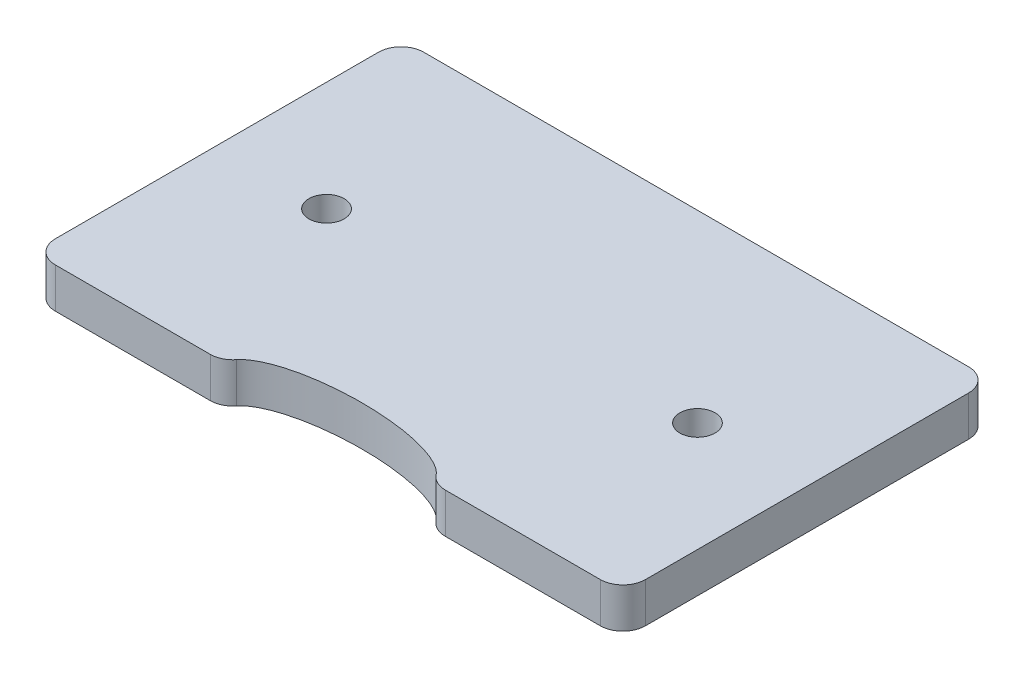
ISO-10303-21;
HEADER;
FILE_DESCRIPTION(('STEP AP214'),'2;1');
FILE_NAME('part.step','',(''),(''),'','','');
FILE_SCHEMA(('AUTOMOTIVE_DESIGN { 1 0 10303 214 1 1 1 1 }'));
ENDSEC;
DATA;
#1=APPLICATION_CONTEXT('core data for automotive mechanical design processes');
#2=APPLICATION_PROTOCOL_DEFINITION('international standard','automotive_design',2000,#1);
#3=PRODUCT_CONTEXT('',#1,'mechanical');
#4=PRODUCT('Part','Part','',(#3));
#5=PRODUCT_RELATED_PRODUCT_CATEGORY('part','',(#4));
#6=PRODUCT_DEFINITION_FORMATION('','',#4);
#7=PRODUCT_DEFINITION_CONTEXT('part definition',#1,'design');
#8=PRODUCT_DEFINITION('design','',#6,#7);
#9=PRODUCT_DEFINITION_SHAPE('','',#8);
#10=(LENGTH_UNIT() NAMED_UNIT(*) SI_UNIT(.MILLI.,.METRE.));
#11=(NAMED_UNIT(*) PLANE_ANGLE_UNIT() SI_UNIT($,.RADIAN.));
#12=(NAMED_UNIT(*) SI_UNIT($,.STERADIAN.) SOLID_ANGLE_UNIT());
#13=UNCERTAINTY_MEASURE_WITH_UNIT(LENGTH_MEASURE(1.E-05),#10,'distance_accuracy_value','');
#14=(GEOMETRIC_REPRESENTATION_CONTEXT(3) GLOBAL_UNCERTAINTY_ASSIGNED_CONTEXT((#13)) GLOBAL_UNIT_ASSIGNED_CONTEXT((#10,
#11,#12)) REPRESENTATION_CONTEXT('',''));
#15=CARTESIAN_POINT('',(0.,0.,0.));
#16=DIRECTION('',(0.,0.,1.));
#17=DIRECTION('',(1.,0.,0.));
#18=AXIS2_PLACEMENT_3D('',#15,#16,#17);
#19=CARTESIAN_POINT('',(0.,4.5,20.675));
#20=DIRECTION('',(0.,1.,0.));
#21=DIRECTION('',(0.,0.,1.));
#22=AXIS2_PLACEMENT_3D('',#19,#20,#21);
#23=PLANE('',#22);
#24=CARTESIAN_POINT('',(-20.8153,4.5,0.));
#25=DIRECTION('',(0.,1.,0.));
#26=DIRECTION('',(0.,0.,1.));
#27=AXIS2_PLACEMENT_3D('',#24,#25,#26);
#28=CIRCLE('',#27,1.975);
#29=CARTESIAN_POINT('',(-20.8153,4.5,1.975));
#30=VERTEX_POINT('',#29);
#31=EDGE_CURVE('E159',#30,#30,#28,.T.);
#32=ORIENTED_EDGE('',*,*,#31,.F.);
#33=EDGE_LOOP('',(#32));
#34=FACE_BOUND('',#33,.T.);
#35=CARTESIAN_POINT('',(30.5816,4.5,18.135));
#36=DIRECTION('',(0.,1.,0.));
#37=DIRECTION('',(0.,0.,-1.));
#38=AXIS2_PLACEMENT_3D('',#35,#36,#37);
#39=CIRCLE('',#38,2.54);
#40=CARTESIAN_POINT('',(30.5816,4.5,20.675));
#41=VERTEX_POINT('',#40);
#42=CARTESIAN_POINT('',(33.1216,4.5,18.135));
#43=VERTEX_POINT('',#42);
#44=EDGE_CURVE('E178',#41,#43,#39,.T.);
#45=ORIENTED_EDGE('',*,*,#44,.T.);
#46=DIRECTION('',(0.,0.,-1.));
#47=VECTOR('',#46,1.);
#48=CARTESIAN_POINT('',(33.1216,4.5,-18.135));
#49=LINE('',#48,#47);
#50=CARTESIAN_POINT('',(33.1216,4.5,-18.135));
#51=VERTEX_POINT('',#50);
#52=EDGE_CURVE('E105',#43,#51,#49,.T.);
#53=ORIENTED_EDGE('',*,*,#52,.T.);
#54=CARTESIAN_POINT('',(30.5816,4.5,-18.135));
#55=DIRECTION('',(0.,1.,0.));
#56=DIRECTION('',(0.,0.,-1.));
#57=AXIS2_PLACEMENT_3D('',#54,#55,#56);
#58=CIRCLE('',#57,2.54);
#59=CARTESIAN_POINT('',(30.5816,4.5,-20.675));
#60=VERTEX_POINT('',#59);
#61=EDGE_CURVE('E205',#51,#60,#58,.T.);
#62=ORIENTED_EDGE('',*,*,#61,.T.);
#63=DIRECTION('',(-1.,0.,0.));
#64=VECTOR('',#63,1.);
#65=CARTESIAN_POINT('',(30.5816,4.5,-20.675));
#66=LINE('',#65,#64);
#67=CARTESIAN_POINT('',(-30.5816,4.5,-20.675));
#68=VERTEX_POINT('',#67);
#69=EDGE_CURVE('E224',#60,#68,#66,.T.);
#70=ORIENTED_EDGE('',*,*,#69,.T.);
#71=CARTESIAN_POINT('',(-30.5816,4.5,-18.135));
#72=DIRECTION('',(0.,1.,0.));
#73=DIRECTION('',(0.,0.,1.));
#74=AXIS2_PLACEMENT_3D('',#71,#72,#73);
#75=CIRCLE('',#74,2.54);
#76=CARTESIAN_POINT('',(-33.1216,4.5,-18.135));
#77=VERTEX_POINT('',#76);
#78=EDGE_CURVE('E221',#68,#77,#75,.T.);
#79=ORIENTED_EDGE('',*,*,#78,.T.);
#80=DIRECTION('',(0.,0.,1.));
#81=VECTOR('',#80,1.);
#82=CARTESIAN_POINT('',(-33.1216,4.5,-18.135));
#83=LINE('',#82,#81);
#84=CARTESIAN_POINT('',(-33.1216,4.5,18.135));
#85=VERTEX_POINT('',#84);
#86=EDGE_CURVE('E223',#77,#85,#83,.T.);
#87=ORIENTED_EDGE('',*,*,#86,.T.);
#88=CARTESIAN_POINT('',(-30.5816,4.5,18.135));
#89=DIRECTION('',(0.,1.,0.));
#90=DIRECTION('',(0.,0.,-1.));
#91=AXIS2_PLACEMENT_3D('',#88,#89,#90);
#92=CIRCLE('',#91,2.54);
#93=CARTESIAN_POINT('',(-30.5816,4.5,20.675));
#94=VERTEX_POINT('',#93);
#95=EDGE_CURVE('E226',#85,#94,#92,.T.);
#96=ORIENTED_EDGE('',*,*,#95,.T.);
#97=DIRECTION('',(1.,0.,0.));
#98=VECTOR('',#97,1.);
#99=CARTESIAN_POINT('',(-13.1872407634371,4.5,20.675));
#100=LINE('',#99,#98);
#101=CARTESIAN_POINT('',(-13.1872407634371,4.5,20.675));
#102=VERTEX_POINT('',#101);
#103=EDGE_CURVE('E232',#94,#102,#100,.T.);
#104=ORIENTED_EDGE('',*,*,#103,.T.);
#105=CARTESIAN_POINT('',(-13.1872407634371,4.5,18.135));
#106=DIRECTION('',(0.,1.,0.));
#107=DIRECTION('',(0.,0.,1.));
#108=AXIS2_PLACEMENT_3D('',#105,#106,#107);
#109=CIRCLE('',#108,2.54);
#110=CARTESIAN_POINT('',(-11.196761954736,4.5,19.7128447680655));
#111=VERTEX_POINT('',#110);
#112=EDGE_CURVE('E136',#102,#111,#109,.T.);
#113=ORIENTED_EDGE('',*,*,#112,.T.);
#114=CARTESIAN_POINT('',(0.,4.5,20.675));
#115=DIRECTION('',(0.,-1.,0.));
#116=DIRECTION('',(-1.,0.,0.));
#117=AXIS2_PLACEMENT_3D('',#114,#115,#116);
#118=ELLIPSE('',#117,11.5718283582089,3.81);
#119=CARTESIAN_POINT('',(11.196761954736,4.5,19.7128447680655));
#120=VERTEX_POINT('',#119);
#121=EDGE_CURVE('E130',#111,#120,#118,.T.);
#122=ORIENTED_EDGE('',*,*,#121,.T.);
#123=CARTESIAN_POINT('',(13.1872407634371,4.5,18.135));
#124=DIRECTION('',(0.,1.,0.));
#125=DIRECTION('',(0.,0.,-1.));
#126=AXIS2_PLACEMENT_3D('',#123,#124,#125);
#127=CIRCLE('',#126,2.54);
#128=CARTESIAN_POINT('',(13.1872407634371,4.5,20.675));
#129=VERTEX_POINT('',#128);
#130=EDGE_CURVE('E134',#120,#129,#127,.T.);
#131=ORIENTED_EDGE('',*,*,#130,.T.);
#132=DIRECTION('',(1.,0.,0.));
#133=VECTOR('',#132,1.);
#134=CARTESIAN_POINT('',(30.5816,4.5,20.675));
#135=LINE('',#134,#133);
#136=EDGE_CURVE('E50',#129,#41,#135,.T.);
#137=ORIENTED_EDGE('',*,*,#136,.T.);
#138=EDGE_LOOP('',(#45,#53,#62,#70,#79,#87,#96,#104,#113,#122,#131,#137));
#139=FACE_BOUND('',#138,.T.);
#140=CARTESIAN_POINT('',(20.8153,4.5,0.));
#141=DIRECTION('',(0.,1.,0.));
#142=DIRECTION('',(0.,0.,-1.));
#143=AXIS2_PLACEMENT_3D('',#140,#141,#142);
#144=CIRCLE('',#143,1.975);
#145=CARTESIAN_POINT('',(20.8153,4.5,-1.97500000000001));
#146=VERTEX_POINT('',#145);
#147=EDGE_CURVE('E275',#146,#146,#144,.T.);
#148=ORIENTED_EDGE('',*,*,#147,.F.);
#149=EDGE_LOOP('',(#148));
#150=FACE_BOUND('',#149,.T.);
#151=ADVANCED_FACE('F33',(#34,#139,#150),#23,.T.);
#152=CARTESIAN_POINT('',(0.,0.,20.675));
#153=DIRECTION('',(0.,1.,0.));
#154=DIRECTION('',(0.,0.,1.));
#155=AXIS2_PLACEMENT_3D('',#152,#153,#154);
#156=PLANE('',#155);
#157=CARTESIAN_POINT('',(-20.8153,0.,0.));
#158=DIRECTION('',(0.,1.,0.));
#159=DIRECTION('',(0.,0.,1.));
#160=AXIS2_PLACEMENT_3D('',#157,#158,#159);
#161=CIRCLE('',#160,1.975);
#162=CARTESIAN_POINT('',(-20.8153,0.,1.975));
#163=VERTEX_POINT('',#162);
#164=EDGE_CURVE('E280',#163,#163,#161,.T.);
#165=ORIENTED_EDGE('',*,*,#164,.T.);
#166=EDGE_LOOP('',(#165));
#167=FACE_BOUND('',#166,.T.);
#168=CARTESIAN_POINT('',(30.5816,0.,18.135));
#169=DIRECTION('',(0.,1.,0.));
#170=DIRECTION('',(0.,0.,-1.));
#171=AXIS2_PLACEMENT_3D('',#168,#169,#170);
#172=CIRCLE('',#171,2.54);
#173=CARTESIAN_POINT('',(30.5816,0.,20.675));
#174=VERTEX_POINT('',#173);
#175=CARTESIAN_POINT('',(33.1216,0.,18.135));
#176=VERTEX_POINT('',#175);
#177=EDGE_CURVE('E155',#174,#176,#172,.T.);
#178=ORIENTED_EDGE('',*,*,#177,.F.);
#179=DIRECTION('',(1.,0.,0.));
#180=VECTOR('',#179,1.);
#181=CARTESIAN_POINT('',(30.5816,0.,20.675));
#182=LINE('',#181,#180);
#183=CARTESIAN_POINT('',(13.1872407634371,0.,20.675));
#184=VERTEX_POINT('',#183);
#185=EDGE_CURVE('E97',#184,#174,#182,.T.);
#186=ORIENTED_EDGE('',*,*,#185,.F.);
#187=CARTESIAN_POINT('',(13.1872407634371,0.,18.135));
#188=DIRECTION('',(0.,1.,0.));
#189=DIRECTION('',(0.,0.,-1.));
#190=AXIS2_PLACEMENT_3D('',#187,#188,#189);
#191=CIRCLE('',#190,2.54);
#192=CARTESIAN_POINT('',(11.196761954736,0.,19.7128447680655));
#193=VERTEX_POINT('',#192);
#194=EDGE_CURVE('E91',#193,#184,#191,.T.);
#195=ORIENTED_EDGE('',*,*,#194,.F.);
#196=CARTESIAN_POINT('',(0.,0.,20.675));
#197=DIRECTION('',(0.,-1.,0.));
#198=DIRECTION('',(-1.,0.,0.));
#199=AXIS2_PLACEMENT_3D('',#196,#197,#198);
#200=ELLIPSE('',#199,11.5718283582089,3.81);
#201=CARTESIAN_POINT('',(-11.196761954736,0.,19.7128447680655));
#202=VERTEX_POINT('',#201);
#203=EDGE_CURVE('E144',#202,#193,#200,.T.);
#204=ORIENTED_EDGE('',*,*,#203,.F.);
#205=CARTESIAN_POINT('',(-13.1872407634371,0.,18.135));
#206=DIRECTION('',(0.,1.,0.));
#207=DIRECTION('',(0.,0.,1.));
#208=AXIS2_PLACEMENT_3D('',#205,#206,#207);
#209=CIRCLE('',#208,2.54);
#210=CARTESIAN_POINT('',(-13.1872407634371,0.,20.675));
#211=VERTEX_POINT('',#210);
#212=EDGE_CURVE('E173',#211,#202,#209,.T.);
#213=ORIENTED_EDGE('',*,*,#212,.F.);
#214=DIRECTION('',(1.,0.,0.));
#215=VECTOR('',#214,1.);
#216=CARTESIAN_POINT('',(-13.1872407634371,0.,20.675));
#217=LINE('',#216,#215);
#218=CARTESIAN_POINT('',(-30.5816,0.,20.675));
#219=VERTEX_POINT('',#218);
#220=EDGE_CURVE('E171',#219,#211,#217,.T.);
#221=ORIENTED_EDGE('',*,*,#220,.F.);
#222=CARTESIAN_POINT('',(-30.5816,0.,18.135));
#223=DIRECTION('',(0.,1.,0.));
#224=DIRECTION('',(0.,0.,-1.));
#225=AXIS2_PLACEMENT_3D('',#222,#223,#224);
#226=CIRCLE('',#225,2.54);
#227=CARTESIAN_POINT('',(-33.1216,0.,18.135));
#228=VERTEX_POINT('',#227);
#229=EDGE_CURVE('E169',#228,#219,#226,.T.);
#230=ORIENTED_EDGE('',*,*,#229,.F.);
#231=DIRECTION('',(0.,0.,1.));
#232=VECTOR('',#231,1.);
#233=CARTESIAN_POINT('',(-33.1216,0.,-18.135));
#234=LINE('',#233,#232);
#235=CARTESIAN_POINT('',(-33.1216,0.,-18.135));
#236=VERTEX_POINT('',#235);
#237=EDGE_CURVE('E167',#236,#228,#234,.T.);
#238=ORIENTED_EDGE('',*,*,#237,.F.);
#239=CARTESIAN_POINT('',(-30.5816,0.,-18.135));
#240=DIRECTION('',(0.,1.,0.));
#241=DIRECTION('',(0.,0.,1.));
#242=AXIS2_PLACEMENT_3D('',#239,#240,#241);
#243=CIRCLE('',#242,2.54);
#244=CARTESIAN_POINT('',(-30.5816,0.,-20.675));
#245=VERTEX_POINT('',#244);
#246=EDGE_CURVE('E165',#245,#236,#243,.T.);
#247=ORIENTED_EDGE('',*,*,#246,.F.);
#248=DIRECTION('',(-1.,0.,0.));
#249=VECTOR('',#248,1.);
#250=CARTESIAN_POINT('',(30.5816,0.,-20.675));
#251=LINE('',#250,#249);
#252=CARTESIAN_POINT('',(30.5816,0.,-20.675));
#253=VERTEX_POINT('',#252);
#254=EDGE_CURVE('E163',#253,#245,#251,.T.);
#255=ORIENTED_EDGE('',*,*,#254,.F.);
#256=CARTESIAN_POINT('',(30.5816,0.,-18.135));
#257=DIRECTION('',(0.,1.,0.));
#258=DIRECTION('',(0.,0.,-1.));
#259=AXIS2_PLACEMENT_3D('',#256,#257,#258);
#260=CIRCLE('',#259,2.54);
#261=CARTESIAN_POINT('',(33.1216,0.,-18.135));
#262=VERTEX_POINT('',#261);
#263=EDGE_CURVE('E161',#262,#253,#260,.T.);
#264=ORIENTED_EDGE('',*,*,#263,.F.);
#265=DIRECTION('',(0.,0.,-1.));
#266=VECTOR('',#265,1.);
#267=CARTESIAN_POINT('',(33.1216,0.,-18.135));
#268=LINE('',#267,#266);
#269=EDGE_CURVE('E158',#176,#262,#268,.T.);
#270=ORIENTED_EDGE('',*,*,#269,.F.);
#271=EDGE_LOOP('',(#178,#186,#195,#204,#213,#221,#230,#238,#247,#255,#264,#270));
#272=FACE_BOUND('',#271,.T.);
#273=CARTESIAN_POINT('',(20.8153,0.,0.));
#274=DIRECTION('',(0.,1.,0.));
#275=DIRECTION('',(0.,0.,-1.));
#276=AXIS2_PLACEMENT_3D('',#273,#274,#275);
#277=CIRCLE('',#276,1.975);
#278=CARTESIAN_POINT('',(20.8153,0.,-1.97500000000001));
#279=VERTEX_POINT('',#278);
#280=EDGE_CURVE('E278',#279,#279,#277,.T.);
#281=ORIENTED_EDGE('',*,*,#280,.T.);
#282=EDGE_LOOP('',(#281));
#283=FACE_BOUND('',#282,.T.);
#284=ADVANCED_FACE('F209',(#167,#272,#283),#156,.F.);
#285=CARTESIAN_POINT('',(30.5816,4.5,18.135));
#286=DIRECTION('',(0.,-1.,0.));
#287=DIRECTION('',(0.,0.,-1.));
#288=AXIS2_PLACEMENT_3D('',#285,#286,#287);
#289=CYLINDRICAL_SURFACE('',#288,2.54);
#290=ORIENTED_EDGE('',*,*,#177,.T.);
#291=DIRECTION('',(0.,-1.,0.));
#292=VECTOR('',#291,1.);
#293=CARTESIAN_POINT('',(33.1216,4.5,18.135));
#294=LINE('',#293,#292);
#295=EDGE_CURVE('E11',#43,#176,#294,.T.);
#296=ORIENTED_EDGE('',*,*,#295,.F.);
#297=ORIENTED_EDGE('',*,*,#44,.F.);
#298=DIRECTION('',(0.,-1.,0.));
#299=VECTOR('',#298,1.);
#300=CARTESIAN_POINT('',(30.5816,4.5,20.675));
#301=LINE('',#300,#299);
#302=EDGE_CURVE('E150',#41,#174,#301,.T.);
#303=ORIENTED_EDGE('',*,*,#302,.T.);
#304=EDGE_LOOP('',(#290,#296,#297,#303));
#305=FACE_BOUND('',#304,.T.);
#306=ADVANCED_FACE('F35',(#305),#289,.T.);
#307=CARTESIAN_POINT('',(33.1216,4.5,-18.135));
#308=DIRECTION('',(-1.,0.,0.));
#309=DIRECTION('',(0.,0.,1.));
#310=AXIS2_PLACEMENT_3D('',#307,#308,#309);
#311=PLANE('',#310);
#312=ORIENTED_EDGE('',*,*,#269,.T.);
#313=DIRECTION('',(0.,-1.,0.));
#314=VECTOR('',#313,1.);
#315=CARTESIAN_POINT('',(33.1216,4.5,-18.135));
#316=LINE('',#315,#314);
#317=EDGE_CURVE('E42',#51,#262,#316,.T.);
#318=ORIENTED_EDGE('',*,*,#317,.F.);
#319=ORIENTED_EDGE('',*,*,#52,.F.);
#320=ORIENTED_EDGE('',*,*,#295,.T.);
#321=EDGE_LOOP('',(#312,#318,#319,#320));
#322=FACE_BOUND('',#321,.T.);
#323=ADVANCED_FACE('F373',(#322),#311,.F.);
#324=CARTESIAN_POINT('',(30.5816,4.5,-18.135));
#325=DIRECTION('',(0.,-1.,0.));
#326=DIRECTION('',(0.,0.,-1.));
#327=AXIS2_PLACEMENT_3D('',#324,#325,#326);
#328=CYLINDRICAL_SURFACE('',#327,2.54);
#329=ORIENTED_EDGE('',*,*,#263,.T.);
#330=DIRECTION('',(0.,-1.,0.));
#331=VECTOR('',#330,1.);
#332=CARTESIAN_POINT('',(30.5816,4.5,-20.675));
#333=LINE('',#332,#331);
#334=EDGE_CURVE('E197',#60,#253,#333,.T.);
#335=ORIENTED_EDGE('',*,*,#334,.F.);
#336=ORIENTED_EDGE('',*,*,#61,.F.);
#337=ORIENTED_EDGE('',*,*,#317,.T.);
#338=EDGE_LOOP('',(#329,#335,#336,#337));
#339=FACE_BOUND('',#338,.T.);
#340=ADVANCED_FACE('F203',(#339),#328,.T.);
#341=CARTESIAN_POINT('',(30.5816,4.5,-20.675));
#342=DIRECTION('',(0.,0.,1.));
#343=DIRECTION('',(1.,0.,0.));
#344=AXIS2_PLACEMENT_3D('',#341,#342,#343);
#345=PLANE('',#344);
#346=ORIENTED_EDGE('',*,*,#254,.T.);
#347=DIRECTION('',(0.,-1.,0.));
#348=VECTOR('',#347,1.);
#349=CARTESIAN_POINT('',(-30.5816,4.5,-20.675));
#350=LINE('',#349,#348);
#351=EDGE_CURVE('E194',#68,#245,#350,.T.);
#352=ORIENTED_EDGE('',*,*,#351,.F.);
#353=ORIENTED_EDGE('',*,*,#69,.F.);
#354=ORIENTED_EDGE('',*,*,#334,.T.);
#355=EDGE_LOOP('',(#346,#352,#353,#354));
#356=FACE_BOUND('',#355,.T.);
#357=ADVANCED_FACE('F215',(#356),#345,.F.);
#358=CARTESIAN_POINT('',(-30.5816,4.5,-18.135));
#359=DIRECTION('',(0.,-1.,0.));
#360=DIRECTION('',(0.,0.,-1.));
#361=AXIS2_PLACEMENT_3D('',#358,#359,#360);
#362=CYLINDRICAL_SURFACE('',#361,2.54);
#363=ORIENTED_EDGE('',*,*,#246,.T.);
#364=DIRECTION('',(0.,-1.,0.));
#365=VECTOR('',#364,1.);
#366=CARTESIAN_POINT('',(-33.1216,4.5,-18.135));
#367=LINE('',#366,#365);
#368=EDGE_CURVE('E191',#77,#236,#367,.T.);
#369=ORIENTED_EDGE('',*,*,#368,.F.);
#370=ORIENTED_EDGE('',*,*,#78,.F.);
#371=ORIENTED_EDGE('',*,*,#351,.T.);
#372=EDGE_LOOP('',(#363,#369,#370,#371));
#373=FACE_BOUND('',#372,.T.);
#374=ADVANCED_FACE('F219',(#373),#362,.T.);
#375=CARTESIAN_POINT('',(-33.1216,4.5,-18.135));
#376=DIRECTION('',(1.,0.,0.));
#377=DIRECTION('',(0.,0.,-1.));
#378=AXIS2_PLACEMENT_3D('',#375,#376,#377);
#379=PLANE('',#378);
#380=ORIENTED_EDGE('',*,*,#237,.T.);
#381=DIRECTION('',(0.,-1.,0.));
#382=VECTOR('',#381,1.);
#383=CARTESIAN_POINT('',(-33.1216,4.5,18.135));
#384=LINE('',#383,#382);
#385=EDGE_CURVE('E188',#85,#228,#384,.T.);
#386=ORIENTED_EDGE('',*,*,#385,.F.);
#387=ORIENTED_EDGE('',*,*,#86,.F.);
#388=ORIENTED_EDGE('',*,*,#368,.T.);
#389=EDGE_LOOP('',(#380,#386,#387,#388));
#390=FACE_BOUND('',#389,.T.);
#391=ADVANCED_FACE('F338',(#390),#379,.F.);
#392=CARTESIAN_POINT('',(-30.5816,4.5,18.135));
#393=DIRECTION('',(0.,-1.,0.));
#394=DIRECTION('',(0.,0.,-1.));
#395=AXIS2_PLACEMENT_3D('',#392,#393,#394);
#396=CYLINDRICAL_SURFACE('',#395,2.54);
#397=ORIENTED_EDGE('',*,*,#229,.T.);
#398=DIRECTION('',(0.,-1.,0.));
#399=VECTOR('',#398,1.);
#400=CARTESIAN_POINT('',(-30.5816,4.5,20.675));
#401=LINE('',#400,#399);
#402=EDGE_CURVE('E185',#94,#219,#401,.T.);
#403=ORIENTED_EDGE('',*,*,#402,.F.);
#404=ORIENTED_EDGE('',*,*,#95,.F.);
#405=ORIENTED_EDGE('',*,*,#385,.T.);
#406=EDGE_LOOP('',(#397,#403,#404,#405));
#407=FACE_BOUND('',#406,.T.);
#408=ADVANCED_FACE('F329',(#407),#396,.T.);
#409=CARTESIAN_POINT('',(-13.1872407634371,4.5,20.675));
#410=DIRECTION('',(0.,0.,-1.));
#411=DIRECTION('',(-1.,0.,0.));
#412=AXIS2_PLACEMENT_3D('',#409,#410,#411);
#413=PLANE('',#412);
#414=ORIENTED_EDGE('',*,*,#220,.T.);
#415=DIRECTION('',(0.,-1.,0.));
#416=VECTOR('',#415,1.);
#417=CARTESIAN_POINT('',(-13.1872407634371,4.5,20.675));
#418=LINE('',#417,#416);
#419=EDGE_CURVE('E182',#102,#211,#418,.T.);
#420=ORIENTED_EDGE('',*,*,#419,.F.);
#421=ORIENTED_EDGE('',*,*,#103,.F.);
#422=ORIENTED_EDGE('',*,*,#402,.T.);
#423=EDGE_LOOP('',(#414,#420,#421,#422));
#424=FACE_BOUND('',#423,.T.);
#425=ADVANCED_FACE('F238',(#424),#413,.F.);
#426=CARTESIAN_POINT('',(-13.1872407634371,4.5,18.135));
#427=DIRECTION('',(0.,-1.,0.));
#428=DIRECTION('',(0.,0.,-1.));
#429=AXIS2_PLACEMENT_3D('',#426,#427,#428);
#430=CYLINDRICAL_SURFACE('',#429,2.54);
#431=ORIENTED_EDGE('',*,*,#212,.T.);
#432=DIRECTION('',(0.,-1.,0.));
#433=VECTOR('',#432,1.);
#434=CARTESIAN_POINT('',(-11.196761954736,4.5,19.7128447680655));
#435=LINE('',#434,#433);
#436=EDGE_CURVE('E145',#111,#202,#435,.T.);
#437=ORIENTED_EDGE('',*,*,#436,.F.);
#438=ORIENTED_EDGE('',*,*,#112,.F.);
#439=ORIENTED_EDGE('',*,*,#419,.T.);
#440=EDGE_LOOP('',(#431,#437,#438,#439));
#441=FACE_BOUND('',#440,.T.);
#442=ADVANCED_FACE('F242',(#441),#430,.T.);
#443=DIRECTION('',(0.,-1.,0.));
#444=VECTOR('',#443,1.);
#445=SURFACE_OF_LINEAR_EXTRUSION('',#118,#444);
#446=ORIENTED_EDGE('',*,*,#203,.T.);
#447=DIRECTION('',(0.,-1.,0.));
#448=VECTOR('',#447,1.);
#449=CARTESIAN_POINT('',(11.196761954736,4.5,19.7128447680655));
#450=LINE('',#449,#448);
#451=EDGE_CURVE('E141',#120,#193,#450,.T.);
#452=ORIENTED_EDGE('',*,*,#451,.F.);
#453=ORIENTED_EDGE('',*,*,#121,.F.);
#454=ORIENTED_EDGE('',*,*,#436,.T.);
#455=EDGE_LOOP('',(#446,#452,#453,#454));
#456=FACE_BOUND('',#455,.T.);
#457=ADVANCED_FACE('F142',(#456),#445,.F.);
#458=CARTESIAN_POINT('',(13.1872407634371,4.5,18.135));
#459=DIRECTION('',(0.,-1.,0.));
#460=DIRECTION('',(0.,0.,-1.));
#461=AXIS2_PLACEMENT_3D('',#458,#459,#460);
#462=CYLINDRICAL_SURFACE('',#461,2.54);
#463=ORIENTED_EDGE('',*,*,#194,.T.);
#464=DIRECTION('',(0.,-1.,0.));
#465=VECTOR('',#464,1.);
#466=CARTESIAN_POINT('',(13.1872407634371,4.5,20.675));
#467=LINE('',#466,#465);
#468=EDGE_CURVE('E146',#129,#184,#467,.T.);
#469=ORIENTED_EDGE('',*,*,#468,.F.);
#470=ORIENTED_EDGE('',*,*,#130,.F.);
#471=ORIENTED_EDGE('',*,*,#451,.T.);
#472=EDGE_LOOP('',(#463,#469,#470,#471));
#473=FACE_BOUND('',#472,.T.);
#474=ADVANCED_FACE('F148',(#473),#462,.T.);
#475=CARTESIAN_POINT('',(30.5816,4.5,20.675));
#476=DIRECTION('',(0.,0.,-1.));
#477=DIRECTION('',(-1.,0.,0.));
#478=AXIS2_PLACEMENT_3D('',#475,#476,#477);
#479=PLANE('',#478);
#480=ORIENTED_EDGE('',*,*,#185,.T.);
#481=ORIENTED_EDGE('',*,*,#302,.F.);
#482=ORIENTED_EDGE('',*,*,#136,.F.);
#483=ORIENTED_EDGE('',*,*,#468,.T.);
#484=EDGE_LOOP('',(#480,#481,#482,#483));
#485=FACE_BOUND('',#484,.T.);
#486=ADVANCED_FACE('F246',(#485),#479,.F.);
#487=CARTESIAN_POINT('',(-20.8153,4.5,0.));
#488=DIRECTION('',(0.,-1.,0.));
#489=DIRECTION('',(0.,0.,-1.));
#490=AXIS2_PLACEMENT_3D('',#487,#488,#489);
#491=CYLINDRICAL_SURFACE('',#490,1.975);
#492=ORIENTED_EDGE('',*,*,#31,.T.);
#493=EDGE_LOOP('',(#492));
#494=FACE_BOUND('',#493,.T.);
#495=ORIENTED_EDGE('',*,*,#164,.F.);
#496=EDGE_LOOP('',(#495));
#497=FACE_BOUND('',#496,.T.);
#498=ADVANCED_FACE('F248',(#494,#497),#491,.F.);
#499=CARTESIAN_POINT('',(20.8153,4.5,0.));
#500=DIRECTION('',(0.,-1.,0.));
#501=DIRECTION('',(0.,0.,-1.));
#502=AXIS2_PLACEMENT_3D('',#499,#500,#501);
#503=CYLINDRICAL_SURFACE('',#502,1.975);
#504=ORIENTED_EDGE('',*,*,#147,.T.);
#505=EDGE_LOOP('',(#504));
#506=FACE_BOUND('',#505,.T.);
#507=ORIENTED_EDGE('',*,*,#280,.F.);
#508=EDGE_LOOP('',(#507));
#509=FACE_BOUND('',#508,.T.);
#510=ADVANCED_FACE('F254',(#506,#509),#503,.F.);
#511=CLOSED_SHELL('',(#151,#284,#306,#323,#340,#357,#374,#391,#408,#425,#442,#457,#474,#486,
#498,#510));
#512=MANIFOLD_SOLID_BREP('B2',#511);
#513=ADVANCED_BREP_SHAPE_REPRESENTATION('',(#18,#512),#14);
#514=SHAPE_DEFINITION_REPRESENTATION(#9,#513);
ENDSEC;
END-ISO-10303-21;
